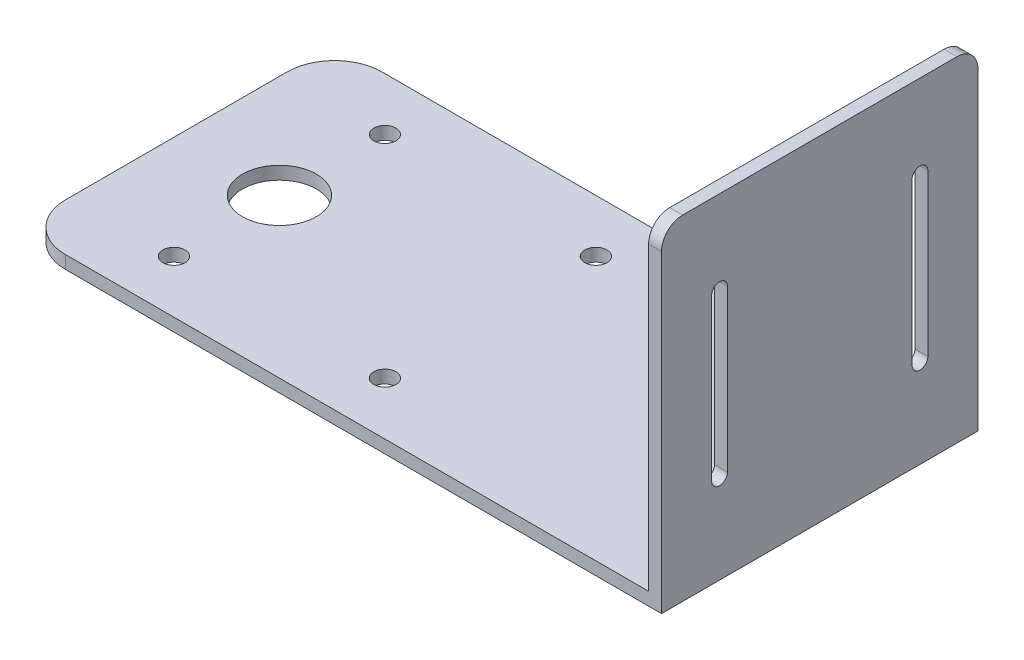
ISO-10303-21;
HEADER;
FILE_DESCRIPTION(('STEP AP214'),'2;1');
FILE_NAME('part.step','',(''),(''),'','','');
FILE_SCHEMA(('AUTOMOTIVE_DESIGN { 1 0 10303 214 1 1 1 1 }'));
ENDSEC;
DATA;
#1=APPLICATION_CONTEXT('core data for automotive mechanical design processes');
#2=APPLICATION_PROTOCOL_DEFINITION('international standard','automotive_design',2000,#1);
#3=PRODUCT_CONTEXT('',#1,'mechanical');
#4=PRODUCT('Part','Part','',(#3));
#5=PRODUCT_RELATED_PRODUCT_CATEGORY('part','',(#4));
#6=PRODUCT_DEFINITION_FORMATION('','',#4);
#7=PRODUCT_DEFINITION_CONTEXT('part definition',#1,'design');
#8=PRODUCT_DEFINITION('design','',#6,#7);
#9=PRODUCT_DEFINITION_SHAPE('','',#8);
#10=(LENGTH_UNIT() NAMED_UNIT(*) SI_UNIT(.MILLI.,.METRE.));
#11=(NAMED_UNIT(*) PLANE_ANGLE_UNIT() SI_UNIT($,.RADIAN.));
#12=(NAMED_UNIT(*) SI_UNIT($,.STERADIAN.) SOLID_ANGLE_UNIT());
#13=UNCERTAINTY_MEASURE_WITH_UNIT(LENGTH_MEASURE(1.E-05),#10,'distance_accuracy_value','');
#14=(GEOMETRIC_REPRESENTATION_CONTEXT(3) GLOBAL_UNCERTAINTY_ASSIGNED_CONTEXT((#13)) GLOBAL_UNIT_ASSIGNED_CONTEXT((#10,
#11,#12)) REPRESENTATION_CONTEXT('',''));
#15=CARTESIAN_POINT('',(0.,0.,0.));
#16=DIRECTION('',(0.,0.,1.));
#17=DIRECTION('',(1.,0.,0.));
#18=AXIS2_PLACEMENT_3D('',#15,#16,#17);
#19=CARTESIAN_POINT('',(0.,2.45,0.));
#20=DIRECTION('',(0.,1.,0.));
#21=DIRECTION('',(0.,0.,1.));
#22=AXIS2_PLACEMENT_3D('',#19,#20,#21);
#23=PLANE('',#22);
#24=DIRECTION('',(0.,0.,1.));
#25=VECTOR('',#24,1.);
#26=CARTESIAN_POINT('',(58.55,2.45,-30.));
#27=LINE('',#26,#25);
#28=CARTESIAN_POINT('',(58.55,2.45,-30.));
#29=VERTEX_POINT('',#28);
#30=CARTESIAN_POINT('',(58.55,2.45,30.));
#31=VERTEX_POINT('',#30);
#32=EDGE_CURVE('E256',#29,#31,#27,.T.);
#33=ORIENTED_EDGE('',*,*,#32,.F.);
#34=DIRECTION('',(-1.,0.,0.));
#35=VECTOR('',#34,1.);
#36=CARTESIAN_POINT('',(-61.,2.45,-30.));
#37=LINE('',#36,#35);
#38=CARTESIAN_POINT('',(-52.,2.45,-30.));
#39=VERTEX_POINT('',#38);
#40=EDGE_CURVE('E324',#29,#39,#37,.T.);
#41=ORIENTED_EDGE('',*,*,#40,.T.);
#42=CARTESIAN_POINT('',(-52.,2.45,-21.));
#43=DIRECTION('',(0.,1.,0.));
#44=DIRECTION('',(0.,0.,1.));
#45=AXIS2_PLACEMENT_3D('',#42,#43,#44);
#46=CIRCLE('',#45,9.);
#47=CARTESIAN_POINT('',(-61.,2.45,-21.));
#48=VERTEX_POINT('',#47);
#49=EDGE_CURVE('E367',#39,#48,#46,.T.);
#50=ORIENTED_EDGE('',*,*,#49,.T.);
#51=DIRECTION('',(0.,0.,1.));
#52=VECTOR('',#51,1.);
#53=CARTESIAN_POINT('',(-61.,2.45,-30.));
#54=LINE('',#53,#52);
#55=CARTESIAN_POINT('',(-61.,2.45,21.));
#56=VERTEX_POINT('',#55);
#57=EDGE_CURVE('E315',#48,#56,#54,.T.);
#58=ORIENTED_EDGE('',*,*,#57,.T.);
#59=CARTESIAN_POINT('',(-52.,2.45,21.));
#60=DIRECTION('',(0.,1.,0.));
#61=DIRECTION('',(0.,0.,1.));
#62=AXIS2_PLACEMENT_3D('',#59,#60,#61);
#63=CIRCLE('',#62,9.);
#64=CARTESIAN_POINT('',(-52.,2.45,30.));
#65=VERTEX_POINT('',#64);
#66=EDGE_CURVE('E364',#56,#65,#63,.T.);
#67=ORIENTED_EDGE('',*,*,#66,.T.);
#68=DIRECTION('',(1.,0.,0.));
#69=VECTOR('',#68,1.);
#70=CARTESIAN_POINT('',(-61.,2.45,30.));
#71=LINE('',#70,#69);
#72=EDGE_CURVE('E319',#65,#31,#71,.T.);
#73=ORIENTED_EDGE('',*,*,#72,.T.);
#74=EDGE_LOOP('',(#33,#41,#50,#58,#67,#73));
#75=FACE_BOUND('',#74,.T.);
#76=CARTESIAN_POINT('',(-1.44999999999957,2.45,20.));
#77=DIRECTION('',(0.,1.,0.));
#78=DIRECTION('',(0.,0.,1.));
#79=AXIS2_PLACEMENT_3D('',#76,#77,#78);
#80=CIRCLE('',#79,2.1);
#81=CARTESIAN_POINT('',(-1.44999999999957,2.45,22.1));
#82=VERTEX_POINT('',#81);
#83=EDGE_CURVE('E283',#82,#82,#80,.T.);
#84=ORIENTED_EDGE('',*,*,#83,.F.);
#85=EDGE_LOOP('',(#84));
#86=FACE_BOUND('',#85,.T.);
#87=CARTESIAN_POINT('',(-41.45,2.45,-20.));
#88=DIRECTION('',(0.,1.,0.));
#89=DIRECTION('',(0.,0.,1.));
#90=AXIS2_PLACEMENT_3D('',#87,#88,#89);
#91=CIRCLE('',#90,2.1);
#92=CARTESIAN_POINT('',(-41.45,2.45,-17.9));
#93=VERTEX_POINT('',#92);
#94=EDGE_CURVE('E299',#93,#93,#91,.T.);
#95=ORIENTED_EDGE('',*,*,#94,.F.);
#96=EDGE_LOOP('',(#95));
#97=FACE_BOUND('',#96,.T.);
#98=CARTESIAN_POINT('',(-41.45,2.45,0.));
#99=DIRECTION('',(0.,1.,0.));
#100=DIRECTION('',(0.,0.,1.));
#101=AXIS2_PLACEMENT_3D('',#98,#99,#100);
#102=CIRCLE('',#101,7.);
#103=CARTESIAN_POINT('',(-41.45,2.45,7.));
#104=VERTEX_POINT('',#103);
#105=EDGE_CURVE('E307',#104,#104,#102,.T.);
#106=ORIENTED_EDGE('',*,*,#105,.F.);
#107=EDGE_LOOP('',(#106));
#108=FACE_BOUND('',#107,.T.);
#109=CARTESIAN_POINT('',(-1.44999999999999,2.45,-20.));
#110=DIRECTION('',(0.,1.,0.));
#111=DIRECTION('',(0.,0.,1.));
#112=AXIS2_PLACEMENT_3D('',#109,#110,#111);
#113=CIRCLE('',#112,2.1);
#114=CARTESIAN_POINT('',(-1.44999999999999,2.45,-17.9));
#115=VERTEX_POINT('',#114);
#116=EDGE_CURVE('E291',#115,#115,#113,.T.);
#117=ORIENTED_EDGE('',*,*,#116,.F.);
#118=EDGE_LOOP('',(#117));
#119=FACE_BOUND('',#118,.T.);
#120=CARTESIAN_POINT('',(-41.4499999999996,2.45,20.));
#121=DIRECTION('',(0.,1.,0.));
#122=DIRECTION('',(0.,0.,1.));
#123=AXIS2_PLACEMENT_3D('',#120,#121,#122);
#124=CIRCLE('',#123,2.1);
#125=CARTESIAN_POINT('',(-41.4499999999996,2.45,22.1));
#126=VERTEX_POINT('',#125);
#127=EDGE_CURVE('E275',#126,#126,#124,.T.);
#128=ORIENTED_EDGE('',*,*,#127,.F.);
#129=EDGE_LOOP('',(#128));
#130=FACE_BOUND('',#129,.T.);
#131=ADVANCED_FACE('F38',(#75,#86,#97,#108,#119,#130),#23,.T.);
#132=CARTESIAN_POINT('',(0.,0.,0.));
#133=DIRECTION('',(0.,1.,0.));
#134=DIRECTION('',(0.,0.,1.));
#135=AXIS2_PLACEMENT_3D('',#132,#133,#134);
#136=PLANE('',#135);
#137=DIRECTION('',(0.,0.,1.));
#138=VECTOR('',#137,1.);
#139=CARTESIAN_POINT('',(-61.,0.,-30.));
#140=LINE('',#139,#138);
#141=CARTESIAN_POINT('',(-61.,0.,-21.));
#142=VERTEX_POINT('',#141);
#143=CARTESIAN_POINT('',(-61.,0.,21.));
#144=VERTEX_POINT('',#143);
#145=EDGE_CURVE('E311',#142,#144,#140,.T.);
#146=ORIENTED_EDGE('',*,*,#145,.F.);
#147=CARTESIAN_POINT('',(-52.,0.,-21.));
#148=DIRECTION('',(0.,1.,0.));
#149=DIRECTION('',(0.,0.,1.));
#150=AXIS2_PLACEMENT_3D('',#147,#148,#149);
#151=CIRCLE('',#150,9.);
#152=CARTESIAN_POINT('',(-52.,0.,-30.));
#153=VERTEX_POINT('',#152);
#154=EDGE_CURVE('E357',#142,#153,#151,.F.);
#155=ORIENTED_EDGE('',*,*,#154,.T.);
#156=DIRECTION('',(-1.,0.,0.));
#157=VECTOR('',#156,1.);
#158=CARTESIAN_POINT('',(-61.,0.,-30.));
#159=LINE('',#158,#157);
#160=CARTESIAN_POINT('',(61.,0.,-30.));
#161=VERTEX_POINT('',#160);
#162=EDGE_CURVE('E320',#161,#153,#159,.T.);
#163=ORIENTED_EDGE('',*,*,#162,.F.);
#164=DIRECTION('',(0.,0.,-1.));
#165=VECTOR('',#164,1.);
#166=CARTESIAN_POINT('',(61.,0.,-30.));
#167=LINE('',#166,#165);
#168=CARTESIAN_POINT('',(61.,0.,30.));
#169=VERTEX_POINT('',#168);
#170=EDGE_CURVE('E335',#169,#161,#167,.T.);
#171=ORIENTED_EDGE('',*,*,#170,.F.);
#172=DIRECTION('',(1.,0.,0.));
#173=VECTOR('',#172,1.);
#174=CARTESIAN_POINT('',(-61.,0.,30.));
#175=LINE('',#174,#173);
#176=CARTESIAN_POINT('',(-52.,0.,30.));
#177=VERTEX_POINT('',#176);
#178=EDGE_CURVE('E331',#177,#169,#175,.T.);
#179=ORIENTED_EDGE('',*,*,#178,.F.);
#180=CARTESIAN_POINT('',(-52.,0.,21.));
#181=DIRECTION('',(0.,1.,0.));
#182=DIRECTION('',(0.,0.,1.));
#183=AXIS2_PLACEMENT_3D('',#180,#181,#182);
#184=CIRCLE('',#183,9.);
#185=EDGE_CURVE('E354',#177,#144,#184,.F.);
#186=ORIENTED_EDGE('',*,*,#185,.T.);
#187=EDGE_LOOP('',(#146,#155,#163,#171,#179,#186));
#188=FACE_BOUND('',#187,.T.);
#189=CARTESIAN_POINT('',(-41.45,0.,0.));
#190=DIRECTION('',(0.,1.,0.));
#191=DIRECTION('',(0.,0.,1.));
#192=AXIS2_PLACEMENT_3D('',#189,#190,#191);
#193=CIRCLE('',#192,7.);
#194=CARTESIAN_POINT('',(-41.45,0.,7.));
#195=VERTEX_POINT('',#194);
#196=EDGE_CURVE('E303',#195,#195,#193,.T.);
#197=ORIENTED_EDGE('',*,*,#196,.T.);
#198=EDGE_LOOP('',(#197));
#199=FACE_BOUND('',#198,.T.);
#200=CARTESIAN_POINT('',(-41.45,0.,-20.));
#201=DIRECTION('',(0.,1.,0.));
#202=DIRECTION('',(0.,0.,1.));
#203=AXIS2_PLACEMENT_3D('',#200,#201,#202);
#204=CIRCLE('',#203,2.1);
#205=CARTESIAN_POINT('',(-41.45,0.,-17.9));
#206=VERTEX_POINT('',#205);
#207=EDGE_CURVE('E295',#206,#206,#204,.T.);
#208=ORIENTED_EDGE('',*,*,#207,.T.);
#209=EDGE_LOOP('',(#208));
#210=FACE_BOUND('',#209,.T.);
#211=CARTESIAN_POINT('',(-1.44999999999999,0.,-20.));
#212=DIRECTION('',(0.,1.,0.));
#213=DIRECTION('',(0.,0.,1.));
#214=AXIS2_PLACEMENT_3D('',#211,#212,#213);
#215=CIRCLE('',#214,2.1);
#216=CARTESIAN_POINT('',(-1.44999999999999,0.,-17.9));
#217=VERTEX_POINT('',#216);
#218=EDGE_CURVE('E287',#217,#217,#215,.T.);
#219=ORIENTED_EDGE('',*,*,#218,.T.);
#220=EDGE_LOOP('',(#219));
#221=FACE_BOUND('',#220,.T.);
#222=CARTESIAN_POINT('',(-1.44999999999957,0.,20.));
#223=DIRECTION('',(0.,1.,0.));
#224=DIRECTION('',(0.,0.,1.));
#225=AXIS2_PLACEMENT_3D('',#222,#223,#224);
#226=CIRCLE('',#225,2.1);
#227=CARTESIAN_POINT('',(-1.44999999999957,0.,22.1));
#228=VERTEX_POINT('',#227);
#229=EDGE_CURVE('E279',#228,#228,#226,.T.);
#230=ORIENTED_EDGE('',*,*,#229,.T.);
#231=EDGE_LOOP('',(#230));
#232=FACE_BOUND('',#231,.T.);
#233=CARTESIAN_POINT('',(-41.4499999999996,0.,20.));
#234=DIRECTION('',(0.,1.,0.));
#235=DIRECTION('',(0.,0.,1.));
#236=AXIS2_PLACEMENT_3D('',#233,#234,#235);
#237=CIRCLE('',#236,2.1);
#238=CARTESIAN_POINT('',(-41.4499999999996,0.,22.1));
#239=VERTEX_POINT('',#238);
#240=EDGE_CURVE('E274',#239,#239,#237,.T.);
#241=ORIENTED_EDGE('',*,*,#240,.T.);
#242=EDGE_LOOP('',(#241));
#243=FACE_BOUND('',#242,.T.);
#244=ADVANCED_FACE('F432',(#188,#199,#210,#221,#232,#243),#136,.F.);
#245=CARTESIAN_POINT('',(-61.,2.45,-30.));
#246=DIRECTION('',(1.,0.,0.));
#247=DIRECTION('',(0.,0.,-1.));
#248=AXIS2_PLACEMENT_3D('',#245,#246,#247);
#249=PLANE('',#248);
#250=ORIENTED_EDGE('',*,*,#57,.F.);
#251=DIRECTION('',(0.,-1.,0.));
#252=VECTOR('',#251,1.);
#253=CARTESIAN_POINT('',(-61.,2.45,-21.));
#254=LINE('',#253,#252);
#255=EDGE_CURVE('E350',#48,#142,#254,.T.);
#256=ORIENTED_EDGE('',*,*,#255,.T.);
#257=ORIENTED_EDGE('',*,*,#145,.T.);
#258=DIRECTION('',(0.,-1.,0.));
#259=VECTOR('',#258,1.);
#260=CARTESIAN_POINT('',(-61.,2.45,21.));
#261=LINE('',#260,#259);
#262=EDGE_CURVE('E347',#144,#56,#261,.F.);
#263=ORIENTED_EDGE('',*,*,#262,.T.);
#264=EDGE_LOOP('',(#250,#256,#257,#263));
#265=FACE_BOUND('',#264,.T.);
#266=ADVANCED_FACE('F438',(#265),#249,.F.);
#267=CARTESIAN_POINT('',(-61.,2.45,30.));
#268=DIRECTION('',(0.,0.,-1.));
#269=DIRECTION('',(-1.,0.,0.));
#270=AXIS2_PLACEMENT_3D('',#267,#268,#269);
#271=PLANE('',#270);
#272=DIRECTION('',(0.,-1.,0.));
#273=VECTOR('',#272,1.);
#274=CARTESIAN_POINT('',(61.,2.45,30.));
#275=LINE('',#274,#273);
#276=CARTESIAN_POINT('',(61.,59.45,30.));
#277=VERTEX_POINT('',#276);
#278=EDGE_CURVE('E344',#277,#169,#275,.T.);
#279=ORIENTED_EDGE('',*,*,#278,.F.);
#280=DIRECTION('',(1.,0.,0.));
#281=VECTOR('',#280,1.);
#282=CARTESIAN_POINT('',(-61.,59.45,30.));
#283=LINE('',#282,#281);
#284=CARTESIAN_POINT('',(58.55,59.45,30.));
#285=VERTEX_POINT('',#284);
#286=EDGE_CURVE('E11',#277,#285,#283,.F.);
#287=ORIENTED_EDGE('',*,*,#286,.T.);
#288=DIRECTION('',(0.,-1.,0.));
#289=VECTOR('',#288,1.);
#290=CARTESIAN_POINT('',(58.55,63.45,30.));
#291=LINE('',#290,#289);
#292=EDGE_CURVE('E265',#285,#31,#291,.T.);
#293=ORIENTED_EDGE('',*,*,#292,.T.);
#294=ORIENTED_EDGE('',*,*,#72,.F.);
#295=DIRECTION('',(0.,-1.,0.));
#296=VECTOR('',#295,1.);
#297=CARTESIAN_POINT('',(-52.,2.45,30.));
#298=LINE('',#297,#296);
#299=EDGE_CURVE('E370',#65,#177,#298,.T.);
#300=ORIENTED_EDGE('',*,*,#299,.T.);
#301=ORIENTED_EDGE('',*,*,#178,.T.);
#302=EDGE_LOOP('',(#279,#287,#293,#294,#300,#301));
#303=FACE_BOUND('',#302,.T.);
#304=ADVANCED_FACE('F425',(#303),#271,.F.);
#305=CARTESIAN_POINT('',(61.,2.45,-30.));
#306=DIRECTION('',(-1.,0.,0.));
#307=DIRECTION('',(0.,0.,1.));
#308=AXIS2_PLACEMENT_3D('',#305,#306,#307);
#309=PLANE('',#308);
#310=DIRECTION('',(0.,-1.,0.));
#311=VECTOR('',#310,1.);
#312=CARTESIAN_POINT('',(61.,2.44999999999999,17.5));
#313=LINE('',#312,#311);
#314=CARTESIAN_POINT('',(61.,47.5,17.5));
#315=VERTEX_POINT('',#314);
#316=CARTESIAN_POINT('',(61.,17.,17.5));
#317=VERTEX_POINT('',#316);
#318=EDGE_CURVE('E248',#315,#317,#313,.T.);
#319=ORIENTED_EDGE('',*,*,#318,.T.);
#320=CARTESIAN_POINT('',(61.,17.,19.));
#321=DIRECTION('',(-1.,0.,0.));
#322=DIRECTION('',(0.,0.,1.));
#323=AXIS2_PLACEMENT_3D('',#320,#321,#322);
#324=CIRCLE('',#323,1.5);
#325=CARTESIAN_POINT('',(61.,17.,20.5));
#326=VERTEX_POINT('',#325);
#327=EDGE_CURVE('E252',#317,#326,#324,.T.);
#328=ORIENTED_EDGE('',*,*,#327,.T.);
#329=DIRECTION('',(0.,1.,0.));
#330=VECTOR('',#329,1.);
#331=CARTESIAN_POINT('',(61.,2.44999999999999,20.5));
#332=LINE('',#331,#330);
#333=CARTESIAN_POINT('',(61.,47.5,20.5));
#334=VERTEX_POINT('',#333);
#335=EDGE_CURVE('E243',#326,#334,#332,.T.);
#336=ORIENTED_EDGE('',*,*,#335,.T.);
#337=CARTESIAN_POINT('',(61.,47.5,19.));
#338=DIRECTION('',(-1.,0.,0.));
#339=DIRECTION('',(0.,0.,1.));
#340=AXIS2_PLACEMENT_3D('',#337,#338,#339);
#341=CIRCLE('',#340,1.5);
#342=EDGE_CURVE('E168',#334,#315,#341,.T.);
#343=ORIENTED_EDGE('',*,*,#342,.T.);
#344=EDGE_LOOP('',(#319,#328,#336,#343));
#345=FACE_BOUND('',#344,.T.);
#346=DIRECTION('',(0.,1.,0.));
#347=VECTOR('',#346,1.);
#348=CARTESIAN_POINT('',(61.,2.45,-17.5));
#349=LINE('',#348,#347);
#350=CARTESIAN_POINT('',(61.,17.,-17.5));
#351=VERTEX_POINT('',#350);
#352=CARTESIAN_POINT('',(61.,47.5,-17.5));
#353=VERTEX_POINT('',#352);
#354=EDGE_CURVE('E235',#351,#353,#349,.T.);
#355=ORIENTED_EDGE('',*,*,#354,.T.);
#356=CARTESIAN_POINT('',(61.,47.5,-19.));
#357=DIRECTION('',(-1.,0.,0.));
#358=DIRECTION('',(0.,0.,1.));
#359=AXIS2_PLACEMENT_3D('',#356,#357,#358);
#360=CIRCLE('',#359,1.5);
#361=CARTESIAN_POINT('',(61.,47.5,-20.5));
#362=VERTEX_POINT('',#361);
#363=EDGE_CURVE('E239',#353,#362,#360,.T.);
#364=ORIENTED_EDGE('',*,*,#363,.T.);
#365=DIRECTION('',(0.,-1.,0.));
#366=VECTOR('',#365,1.);
#367=CARTESIAN_POINT('',(61.,2.45,-20.5));
#368=LINE('',#367,#366);
#369=CARTESIAN_POINT('',(61.,17.,-20.5));
#370=VERTEX_POINT('',#369);
#371=EDGE_CURVE('E197',#362,#370,#368,.T.);
#372=ORIENTED_EDGE('',*,*,#371,.T.);
#373=CARTESIAN_POINT('',(61.,17.,-19.));
#374=DIRECTION('',(-1.,0.,0.));
#375=DIRECTION('',(0.,0.,1.));
#376=AXIS2_PLACEMENT_3D('',#373,#374,#375);
#377=CIRCLE('',#376,1.5);
#378=EDGE_CURVE('E231',#370,#351,#377,.T.);
#379=ORIENTED_EDGE('',*,*,#378,.T.);
#380=EDGE_LOOP('',(#355,#364,#372,#379));
#381=FACE_BOUND('',#380,.T.);
#382=DIRECTION('',(0.,-1.,0.));
#383=VECTOR('',#382,1.);
#384=CARTESIAN_POINT('',(61.,2.45,-30.));
#385=LINE('',#384,#383);
#386=CARTESIAN_POINT('',(61.,59.45,-30.));
#387=VERTEX_POINT('',#386);
#388=EDGE_CURVE('E327',#387,#161,#385,.T.);
#389=ORIENTED_EDGE('',*,*,#388,.F.);
#390=CARTESIAN_POINT('',(61.,59.45,-26.));
#391=DIRECTION('',(-1.,0.,0.));
#392=DIRECTION('',(0.,0.,1.));
#393=AXIS2_PLACEMENT_3D('',#390,#391,#392);
#394=CIRCLE('',#393,4.);
#395=CARTESIAN_POINT('',(61.,63.45,-26.));
#396=VERTEX_POINT('',#395);
#397=EDGE_CURVE('E47',#387,#396,#394,.F.);
#398=ORIENTED_EDGE('',*,*,#397,.T.);
#399=DIRECTION('',(0.,0.,-1.));
#400=VECTOR('',#399,1.);
#401=CARTESIAN_POINT('',(61.,63.45,-30.));
#402=LINE('',#401,#400);
#403=CARTESIAN_POINT('',(61.,63.45,26.));
#404=VERTEX_POINT('',#403);
#405=EDGE_CURVE('E257',#404,#396,#402,.T.);
#406=ORIENTED_EDGE('',*,*,#405,.F.);
#407=CARTESIAN_POINT('',(61.,59.45,26.));
#408=DIRECTION('',(-1.,0.,0.));
#409=DIRECTION('',(0.,0.,1.));
#410=AXIS2_PLACEMENT_3D('',#407,#408,#409);
#411=CIRCLE('',#410,4.);
#412=EDGE_CURVE('E391',#404,#277,#411,.F.);
#413=ORIENTED_EDGE('',*,*,#412,.T.);
#414=ORIENTED_EDGE('',*,*,#278,.T.);
#415=ORIENTED_EDGE('',*,*,#170,.T.);
#416=EDGE_LOOP('',(#389,#398,#406,#413,#414,#415));
#417=FACE_BOUND('',#416,.T.);
#418=ADVANCED_FACE('F398',(#345,#381,#417),#309,.F.);
#419=CARTESIAN_POINT('',(-61.,2.45,-30.));
#420=DIRECTION('',(0.,0.,1.));
#421=DIRECTION('',(1.,0.,0.));
#422=AXIS2_PLACEMENT_3D('',#419,#420,#421);
#423=PLANE('',#422);
#424=DIRECTION('',(0.,-1.,0.));
#425=VECTOR('',#424,1.);
#426=CARTESIAN_POINT('',(58.55,63.45,-30.));
#427=LINE('',#426,#425);
#428=CARTESIAN_POINT('',(58.55,59.45,-30.));
#429=VERTEX_POINT('',#428);
#430=EDGE_CURVE('E271',#429,#29,#427,.T.);
#431=ORIENTED_EDGE('',*,*,#430,.F.);
#432=DIRECTION('',(-1.,0.,0.));
#433=VECTOR('',#432,1.);
#434=CARTESIAN_POINT('',(-61.,59.45,-30.));
#435=LINE('',#434,#433);
#436=EDGE_CURVE('E388',#429,#387,#435,.F.);
#437=ORIENTED_EDGE('',*,*,#436,.T.);
#438=ORIENTED_EDGE('',*,*,#388,.T.);
#439=ORIENTED_EDGE('',*,*,#162,.T.);
#440=DIRECTION('',(0.,-1.,0.));
#441=VECTOR('',#440,1.);
#442=CARTESIAN_POINT('',(-52.,2.45,-30.));
#443=LINE('',#442,#441);
#444=EDGE_CURVE('E360',#153,#39,#443,.F.);
#445=ORIENTED_EDGE('',*,*,#444,.T.);
#446=ORIENTED_EDGE('',*,*,#40,.F.);
#447=EDGE_LOOP('',(#431,#437,#438,#439,#445,#446));
#448=FACE_BOUND('',#447,.T.);
#449=ADVANCED_FACE('F412',(#448),#423,.F.);
#450=CARTESIAN_POINT('',(-41.45,2.45,0.));
#451=DIRECTION('',(0.,-1.,0.));
#452=DIRECTION('',(0.,0.,-1.));
#453=AXIS2_PLACEMENT_3D('',#450,#451,#452);
#454=CYLINDRICAL_SURFACE('',#453,7.);
#455=ORIENTED_EDGE('',*,*,#105,.T.);
#456=EDGE_LOOP('',(#455));
#457=FACE_BOUND('',#456,.T.);
#458=ORIENTED_EDGE('',*,*,#196,.F.);
#459=EDGE_LOOP('',(#458));
#460=FACE_BOUND('',#459,.T.);
#461=ADVANCED_FACE('F459',(#457,#460),#454,.F.);
#462=CARTESIAN_POINT('',(-41.45,2.45,-20.));
#463=DIRECTION('',(0.,-1.,0.));
#464=DIRECTION('',(0.,0.,-1.));
#465=AXIS2_PLACEMENT_3D('',#462,#463,#464);
#466=CYLINDRICAL_SURFACE('',#465,2.1);
#467=ORIENTED_EDGE('',*,*,#94,.T.);
#468=EDGE_LOOP('',(#467));
#469=FACE_BOUND('',#468,.T.);
#470=ORIENTED_EDGE('',*,*,#207,.F.);
#471=EDGE_LOOP('',(#470));
#472=FACE_BOUND('',#471,.T.);
#473=ADVANCED_FACE('F496',(#469,#472),#466,.F.);
#474=CARTESIAN_POINT('',(-1.44999999999999,2.45,-20.));
#475=DIRECTION('',(0.,-1.,0.));
#476=DIRECTION('',(0.,0.,-1.));
#477=AXIS2_PLACEMENT_3D('',#474,#475,#476);
#478=CYLINDRICAL_SURFACE('',#477,2.1);
#479=ORIENTED_EDGE('',*,*,#116,.T.);
#480=EDGE_LOOP('',(#479));
#481=FACE_BOUND('',#480,.T.);
#482=ORIENTED_EDGE('',*,*,#218,.F.);
#483=EDGE_LOOP('',(#482));
#484=FACE_BOUND('',#483,.T.);
#485=ADVANCED_FACE('F503',(#481,#484),#478,.F.);
#486=CARTESIAN_POINT('',(-1.44999999999957,2.45,20.));
#487=DIRECTION('',(0.,-1.,0.));
#488=DIRECTION('',(0.,0.,-1.));
#489=AXIS2_PLACEMENT_3D('',#486,#487,#488);
#490=CYLINDRICAL_SURFACE('',#489,2.1);
#491=ORIENTED_EDGE('',*,*,#83,.T.);
#492=EDGE_LOOP('',(#491));
#493=FACE_BOUND('',#492,.T.);
#494=ORIENTED_EDGE('',*,*,#229,.F.);
#495=EDGE_LOOP('',(#494));
#496=FACE_BOUND('',#495,.T.);
#497=ADVANCED_FACE('F510',(#493,#496),#490,.F.);
#498=CARTESIAN_POINT('',(-41.4499999999996,2.45,20.));
#499=DIRECTION('',(0.,-1.,0.));
#500=DIRECTION('',(0.,0.,-1.));
#501=AXIS2_PLACEMENT_3D('',#498,#499,#500);
#502=CYLINDRICAL_SURFACE('',#501,2.1);
#503=ORIENTED_EDGE('',*,*,#127,.T.);
#504=EDGE_LOOP('',(#503));
#505=FACE_BOUND('',#504,.T.);
#506=ORIENTED_EDGE('',*,*,#240,.F.);
#507=EDGE_LOOP('',(#506));
#508=FACE_BOUND('',#507,.T.);
#509=ADVANCED_FACE('F450',(#505,#508),#502,.F.);
#510=CARTESIAN_POINT('',(-52.,2.45,-21.));
#511=DIRECTION('',(0.,-1.,0.));
#512=DIRECTION('',(0.,0.,-1.));
#513=AXIS2_PLACEMENT_3D('',#510,#511,#512);
#514=CYLINDRICAL_SURFACE('',#513,9.);
#515=ORIENTED_EDGE('',*,*,#49,.F.);
#516=ORIENTED_EDGE('',*,*,#444,.F.);
#517=ORIENTED_EDGE('',*,*,#154,.F.);
#518=ORIENTED_EDGE('',*,*,#255,.F.);
#519=EDGE_LOOP('',(#515,#516,#517,#518));
#520=FACE_BOUND('',#519,.T.);
#521=ADVANCED_FACE('F435',(#520),#514,.T.);
#522=CARTESIAN_POINT('',(-52.,2.45,21.));
#523=DIRECTION('',(0.,-1.,0.));
#524=DIRECTION('',(0.,0.,-1.));
#525=AXIS2_PLACEMENT_3D('',#522,#523,#524);
#526=CYLINDRICAL_SURFACE('',#525,9.);
#527=ORIENTED_EDGE('',*,*,#66,.F.);
#528=ORIENTED_EDGE('',*,*,#262,.F.);
#529=ORIENTED_EDGE('',*,*,#185,.F.);
#530=ORIENTED_EDGE('',*,*,#299,.F.);
#531=EDGE_LOOP('',(#527,#528,#529,#530));
#532=FACE_BOUND('',#531,.T.);
#533=ADVANCED_FACE('F442',(#532),#526,.T.);
#534=CARTESIAN_POINT('',(58.55,63.45,-30.));
#535=DIRECTION('',(1.,0.,0.));
#536=DIRECTION('',(0.,0.,-1.));
#537=AXIS2_PLACEMENT_3D('',#534,#535,#536);
#538=PLANE('',#537);
#539=DIRECTION('',(0.,1.,0.));
#540=VECTOR('',#539,1.);
#541=CARTESIAN_POINT('',(58.55,47.5,20.5));
#542=LINE('',#541,#540);
#543=CARTESIAN_POINT('',(58.55,17.,20.5));
#544=VERTEX_POINT('',#543);
#545=CARTESIAN_POINT('',(58.55,47.5,20.5));
#546=VERTEX_POINT('',#545);
#547=EDGE_CURVE('E176',#544,#546,#542,.T.);
#548=ORIENTED_EDGE('',*,*,#547,.F.);
#549=CARTESIAN_POINT('',(58.55,17.,19.));
#550=DIRECTION('',(-1.,0.,0.));
#551=DIRECTION('',(0.,0.,-1.));
#552=AXIS2_PLACEMENT_3D('',#549,#550,#551);
#553=CIRCLE('',#552,1.5);
#554=CARTESIAN_POINT('',(58.55,17.,17.5));
#555=VERTEX_POINT('',#554);
#556=EDGE_CURVE('E182',#555,#544,#553,.T.);
#557=ORIENTED_EDGE('',*,*,#556,.F.);
#558=DIRECTION('',(0.,-1.,0.));
#559=VECTOR('',#558,1.);
#560=CARTESIAN_POINT('',(58.55,47.5,17.5));
#561=LINE('',#560,#559);
#562=CARTESIAN_POINT('',(58.55,47.5,17.5));
#563=VERTEX_POINT('',#562);
#564=EDGE_CURVE('E187',#563,#555,#561,.T.);
#565=ORIENTED_EDGE('',*,*,#564,.F.);
#566=CARTESIAN_POINT('',(58.55,47.5,19.));
#567=DIRECTION('',(-1.,0.,0.));
#568=DIRECTION('',(0.,0.,-1.));
#569=AXIS2_PLACEMENT_3D('',#566,#567,#568);
#570=CIRCLE('',#569,1.5);
#571=EDGE_CURVE('E165',#546,#563,#570,.T.);
#572=ORIENTED_EDGE('',*,*,#571,.F.);
#573=EDGE_LOOP('',(#548,#557,#565,#572));
#574=FACE_BOUND('',#573,.T.);
#575=DIRECTION('',(0.,-1.,0.));
#576=VECTOR('',#575,1.);
#577=CARTESIAN_POINT('',(58.55,47.5,-20.5));
#578=LINE('',#577,#576);
#579=CARTESIAN_POINT('',(58.55,47.5,-20.5));
#580=VERTEX_POINT('',#579);
#581=CARTESIAN_POINT('',(58.55,17.,-20.5));
#582=VERTEX_POINT('',#581);
#583=EDGE_CURVE('E205',#580,#582,#578,.T.);
#584=ORIENTED_EDGE('',*,*,#583,.F.);
#585=CARTESIAN_POINT('',(58.55,47.5,-19.));
#586=DIRECTION('',(-1.,0.,0.));
#587=DIRECTION('',(0.,0.,1.));
#588=AXIS2_PLACEMENT_3D('',#585,#586,#587);
#589=CIRCLE('',#588,1.5);
#590=CARTESIAN_POINT('',(58.55,47.5,-17.5));
#591=VERTEX_POINT('',#590);
#592=EDGE_CURVE('E202',#591,#580,#589,.T.);
#593=ORIENTED_EDGE('',*,*,#592,.F.);
#594=DIRECTION('',(0.,1.,0.));
#595=VECTOR('',#594,1.);
#596=CARTESIAN_POINT('',(58.55,47.5,-17.5));
#597=LINE('',#596,#595);
#598=CARTESIAN_POINT('',(58.55,17.,-17.5));
#599=VERTEX_POINT('',#598);
#600=EDGE_CURVE('E212',#599,#591,#597,.T.);
#601=ORIENTED_EDGE('',*,*,#600,.F.);
#602=CARTESIAN_POINT('',(58.55,17.,-19.));
#603=DIRECTION('',(-1.,0.,0.));
#604=DIRECTION('',(0.,0.,1.));
#605=AXIS2_PLACEMENT_3D('',#602,#603,#604);
#606=CIRCLE('',#605,1.5);
#607=EDGE_CURVE('E208',#582,#599,#606,.T.);
#608=ORIENTED_EDGE('',*,*,#607,.F.);
#609=EDGE_LOOP('',(#584,#593,#601,#608));
#610=FACE_BOUND('',#609,.T.);
#611=DIRECTION('',(0.,0.,1.));
#612=VECTOR('',#611,1.);
#613=CARTESIAN_POINT('',(58.55,63.45,-30.));
#614=LINE('',#613,#612);
#615=CARTESIAN_POINT('',(58.55,63.45,-26.));
#616=VERTEX_POINT('',#615);
#617=CARTESIAN_POINT('',(58.55,63.45,26.));
#618=VERTEX_POINT('',#617);
#619=EDGE_CURVE('E261',#616,#618,#614,.T.);
#620=ORIENTED_EDGE('',*,*,#619,.F.);
#621=CARTESIAN_POINT('',(58.55,59.45,-26.));
#622=DIRECTION('',(1.,0.,0.));
#623=DIRECTION('',(0.,0.,-1.));
#624=AXIS2_PLACEMENT_3D('',#621,#622,#623);
#625=CIRCLE('',#624,4.);
#626=EDGE_CURVE('E385',#616,#429,#625,.F.);
#627=ORIENTED_EDGE('',*,*,#626,.T.);
#628=ORIENTED_EDGE('',*,*,#430,.T.);
#629=ORIENTED_EDGE('',*,*,#32,.T.);
#630=ORIENTED_EDGE('',*,*,#292,.F.);
#631=CARTESIAN_POINT('',(58.55,59.45,26.));
#632=DIRECTION('',(1.,0.,0.));
#633=DIRECTION('',(0.,0.,-1.));
#634=AXIS2_PLACEMENT_3D('',#631,#632,#633);
#635=CIRCLE('',#634,4.);
#636=EDGE_CURVE('E382',#285,#618,#635,.F.);
#637=ORIENTED_EDGE('',*,*,#636,.T.);
#638=EDGE_LOOP('',(#620,#627,#628,#629,#630,#637));
#639=FACE_BOUND('',#638,.T.);
#640=ADVANCED_FACE('F184',(#574,#610,#639),#538,.F.);
#641=CARTESIAN_POINT('',(0.,63.45,0.));
#642=DIRECTION('',(0.,-1.,0.));
#643=DIRECTION('',(0.,0.,-1.));
#644=AXIS2_PLACEMENT_3D('',#641,#642,#643);
#645=PLANE('',#644);
#646=ORIENTED_EDGE('',*,*,#405,.T.);
#647=DIRECTION('',(-1.,0.,0.));
#648=VECTOR('',#647,1.);
#649=CARTESIAN_POINT('',(0.,63.45,-26.));
#650=LINE('',#649,#648);
#651=EDGE_CURVE('E378',#396,#616,#650,.T.);
#652=ORIENTED_EDGE('',*,*,#651,.T.);
#653=ORIENTED_EDGE('',*,*,#619,.T.);
#654=DIRECTION('',(1.,0.,0.));
#655=VECTOR('',#654,1.);
#656=CARTESIAN_POINT('',(0.,63.45,26.));
#657=LINE('',#656,#655);
#658=EDGE_CURVE('E374',#618,#404,#657,.T.);
#659=ORIENTED_EDGE('',*,*,#658,.T.);
#660=EDGE_LOOP('',(#646,#652,#653,#659));
#661=FACE_BOUND('',#660,.T.);
#662=ADVANCED_FACE('F403',(#661),#645,.F.);
#663=CARTESIAN_POINT('',(0.,59.45,-26.));
#664=DIRECTION('',(-1.,0.,0.));
#665=DIRECTION('',(0.,0.,1.));
#666=AXIS2_PLACEMENT_3D('',#663,#664,#665);
#667=CYLINDRICAL_SURFACE('',#666,4.);
#668=ORIENTED_EDGE('',*,*,#397,.F.);
#669=ORIENTED_EDGE('',*,*,#436,.F.);
#670=ORIENTED_EDGE('',*,*,#626,.F.);
#671=ORIENTED_EDGE('',*,*,#651,.F.);
#672=EDGE_LOOP('',(#668,#669,#670,#671));
#673=FACE_BOUND('',#672,.T.);
#674=ADVANCED_FACE('F406',(#673),#667,.T.);
#675=CARTESIAN_POINT('',(0.,59.45,26.));
#676=DIRECTION('',(1.,0.,0.));
#677=DIRECTION('',(0.,0.,-1.));
#678=AXIS2_PLACEMENT_3D('',#675,#676,#677);
#679=CYLINDRICAL_SURFACE('',#678,4.);
#680=ORIENTED_EDGE('',*,*,#636,.F.);
#681=ORIENTED_EDGE('',*,*,#286,.F.);
#682=ORIENTED_EDGE('',*,*,#412,.F.);
#683=ORIENTED_EDGE('',*,*,#658,.F.);
#684=EDGE_LOOP('',(#680,#681,#682,#683));
#685=FACE_BOUND('',#684,.T.);
#686=ADVANCED_FACE('F40',(#685),#679,.T.);
#687=CARTESIAN_POINT('',(119.55,47.5,-19.));
#688=DIRECTION('',(-1.,0.,0.));
#689=DIRECTION('',(0.,0.,1.));
#690=AXIS2_PLACEMENT_3D('',#687,#688,#689);
#691=CYLINDRICAL_SURFACE('',#690,1.5);
#692=DIRECTION('',(-1.,0.,0.));
#693=VECTOR('',#692,1.);
#694=CARTESIAN_POINT('',(119.55,47.5,-17.5));
#695=LINE('',#694,#693);
#696=EDGE_CURVE('E217',#353,#591,#695,.T.);
#697=ORIENTED_EDGE('',*,*,#696,.T.);
#698=ORIENTED_EDGE('',*,*,#592,.T.);
#699=DIRECTION('',(-1.,0.,0.));
#700=VECTOR('',#699,1.);
#701=CARTESIAN_POINT('',(119.55,47.5,-20.5));
#702=LINE('',#701,#700);
#703=EDGE_CURVE('E216',#362,#580,#702,.T.);
#704=ORIENTED_EDGE('',*,*,#703,.F.);
#705=ORIENTED_EDGE('',*,*,#363,.F.);
#706=EDGE_LOOP('',(#697,#698,#704,#705));
#707=FACE_BOUND('',#706,.T.);
#708=ADVANCED_FACE('F594',(#707),#691,.F.);
#709=CARTESIAN_POINT('',(119.55,47.5,-17.5));
#710=DIRECTION('',(0.,0.,1.));
#711=DIRECTION('',(1.,0.,0.));
#712=AXIS2_PLACEMENT_3D('',#709,#710,#711);
#713=PLANE('',#712);
#714=DIRECTION('',(-1.,0.,0.));
#715=VECTOR('',#714,1.);
#716=CARTESIAN_POINT('',(119.55,17.,-17.5));
#717=LINE('',#716,#715);
#718=EDGE_CURVE('E220',#351,#599,#717,.T.);
#719=ORIENTED_EDGE('',*,*,#718,.T.);
#720=ORIENTED_EDGE('',*,*,#600,.T.);
#721=ORIENTED_EDGE('',*,*,#696,.F.);
#722=ORIENTED_EDGE('',*,*,#354,.F.);
#723=EDGE_LOOP('',(#719,#720,#721,#722));
#724=FACE_BOUND('',#723,.T.);
#725=ADVANCED_FACE('F600',(#724),#713,.F.);
#726=CARTESIAN_POINT('',(119.55,17.,-19.));
#727=DIRECTION('',(-1.,0.,0.));
#728=DIRECTION('',(0.,0.,1.));
#729=AXIS2_PLACEMENT_3D('',#726,#727,#728);
#730=CYLINDRICAL_SURFACE('',#729,1.5);
#731=DIRECTION('',(-1.,0.,0.));
#732=VECTOR('',#731,1.);
#733=CARTESIAN_POINT('',(119.55,17.,-20.5));
#734=LINE('',#733,#732);
#735=EDGE_CURVE('E62',#370,#582,#734,.T.);
#736=ORIENTED_EDGE('',*,*,#735,.T.);
#737=ORIENTED_EDGE('',*,*,#607,.T.);
#738=ORIENTED_EDGE('',*,*,#718,.F.);
#739=ORIENTED_EDGE('',*,*,#378,.F.);
#740=EDGE_LOOP('',(#736,#737,#738,#739));
#741=FACE_BOUND('',#740,.T.);
#742=ADVANCED_FACE('F609',(#741),#730,.F.);
#743=CARTESIAN_POINT('',(119.55,47.5,-20.5));
#744=DIRECTION('',(0.,0.,-1.));
#745=DIRECTION('',(-1.,0.,0.));
#746=AXIS2_PLACEMENT_3D('',#743,#744,#745);
#747=PLANE('',#746);
#748=ORIENTED_EDGE('',*,*,#703,.T.);
#749=ORIENTED_EDGE('',*,*,#583,.T.);
#750=ORIENTED_EDGE('',*,*,#735,.F.);
#751=ORIENTED_EDGE('',*,*,#371,.F.);
#752=EDGE_LOOP('',(#748,#749,#750,#751));
#753=FACE_BOUND('',#752,.T.);
#754=ADVANCED_FACE('F618',(#753),#747,.F.);
#755=CARTESIAN_POINT('',(119.55,17.,19.));
#756=DIRECTION('',(-1.,0.,0.));
#757=DIRECTION('',(0.,0.,1.));
#758=AXIS2_PLACEMENT_3D('',#755,#756,#757);
#759=CYLINDRICAL_SURFACE('',#758,1.5);
#760=DIRECTION('',(-1.,0.,0.));
#761=VECTOR('',#760,1.);
#762=CARTESIAN_POINT('',(119.55,17.,17.5));
#763=LINE('',#762,#761);
#764=EDGE_CURVE('E194',#317,#555,#763,.T.);
#765=ORIENTED_EDGE('',*,*,#764,.T.);
#766=ORIENTED_EDGE('',*,*,#556,.T.);
#767=DIRECTION('',(-1.,0.,0.));
#768=VECTOR('',#767,1.);
#769=CARTESIAN_POINT('',(119.55,17.,20.5));
#770=LINE('',#769,#768);
#771=EDGE_CURVE('E172',#326,#544,#770,.T.);
#772=ORIENTED_EDGE('',*,*,#771,.F.);
#773=ORIENTED_EDGE('',*,*,#327,.F.);
#774=EDGE_LOOP('',(#765,#766,#772,#773));
#775=FACE_BOUND('',#774,.T.);
#776=ADVANCED_FACE('F627',(#775),#759,.F.);
#777=CARTESIAN_POINT('',(119.55,47.5,17.5));
#778=DIRECTION('',(0.,0.,-1.));
#779=DIRECTION('',(-1.,0.,0.));
#780=AXIS2_PLACEMENT_3D('',#777,#778,#779);
#781=PLANE('',#780);
#782=DIRECTION('',(-1.,0.,0.));
#783=VECTOR('',#782,1.);
#784=CARTESIAN_POINT('',(119.55,47.5,17.5));
#785=LINE('',#784,#783);
#786=EDGE_CURVE('E171',#315,#563,#785,.T.);
#787=ORIENTED_EDGE('',*,*,#786,.T.);
#788=ORIENTED_EDGE('',*,*,#564,.T.);
#789=ORIENTED_EDGE('',*,*,#764,.F.);
#790=ORIENTED_EDGE('',*,*,#318,.F.);
#791=EDGE_LOOP('',(#787,#788,#789,#790));
#792=FACE_BOUND('',#791,.T.);
#793=ADVANCED_FACE('F635',(#792),#781,.F.);
#794=CARTESIAN_POINT('',(119.55,47.5,19.));
#795=DIRECTION('',(-1.,0.,0.));
#796=DIRECTION('',(0.,0.,1.));
#797=AXIS2_PLACEMENT_3D('',#794,#795,#796);
#798=CYLINDRICAL_SURFACE('',#797,1.5);
#799=DIRECTION('',(-1.,0.,0.));
#800=VECTOR('',#799,1.);
#801=CARTESIAN_POINT('',(119.55,47.5,20.5));
#802=LINE('',#801,#800);
#803=EDGE_CURVE('E54',#334,#546,#802,.T.);
#804=ORIENTED_EDGE('',*,*,#803,.T.);
#805=ORIENTED_EDGE('',*,*,#571,.T.);
#806=ORIENTED_EDGE('',*,*,#786,.F.);
#807=ORIENTED_EDGE('',*,*,#342,.F.);
#808=EDGE_LOOP('',(#804,#805,#806,#807));
#809=FACE_BOUND('',#808,.T.);
#810=ADVANCED_FACE('F162',(#809),#798,.F.);
#811=CARTESIAN_POINT('',(119.55,47.5,20.5));
#812=DIRECTION('',(0.,0.,1.));
#813=DIRECTION('',(1.,0.,0.));
#814=AXIS2_PLACEMENT_3D('',#811,#812,#813);
#815=PLANE('',#814);
#816=ORIENTED_EDGE('',*,*,#771,.T.);
#817=ORIENTED_EDGE('',*,*,#547,.T.);
#818=ORIENTED_EDGE('',*,*,#803,.F.);
#819=ORIENTED_EDGE('',*,*,#335,.F.);
#820=EDGE_LOOP('',(#816,#817,#818,#819));
#821=FACE_BOUND('',#820,.T.);
#822=ADVANCED_FACE('F177',(#821),#815,.F.);
#823=CLOSED_SHELL('',(#131,#244,#266,#304,#418,#449,#461,#473,#485,#497,#509,#521,#533,#640,
#662,#674,#686,#708,#725,#742,#754,#776,#793,#810,#822));
#824=MANIFOLD_SOLID_BREP('B2',#823);
#825=ADVANCED_BREP_SHAPE_REPRESENTATION('',(#18,#824),#14);
#826=SHAPE_DEFINITION_REPRESENTATION(#9,#825);
ENDSEC;
END-ISO-10303-21;
